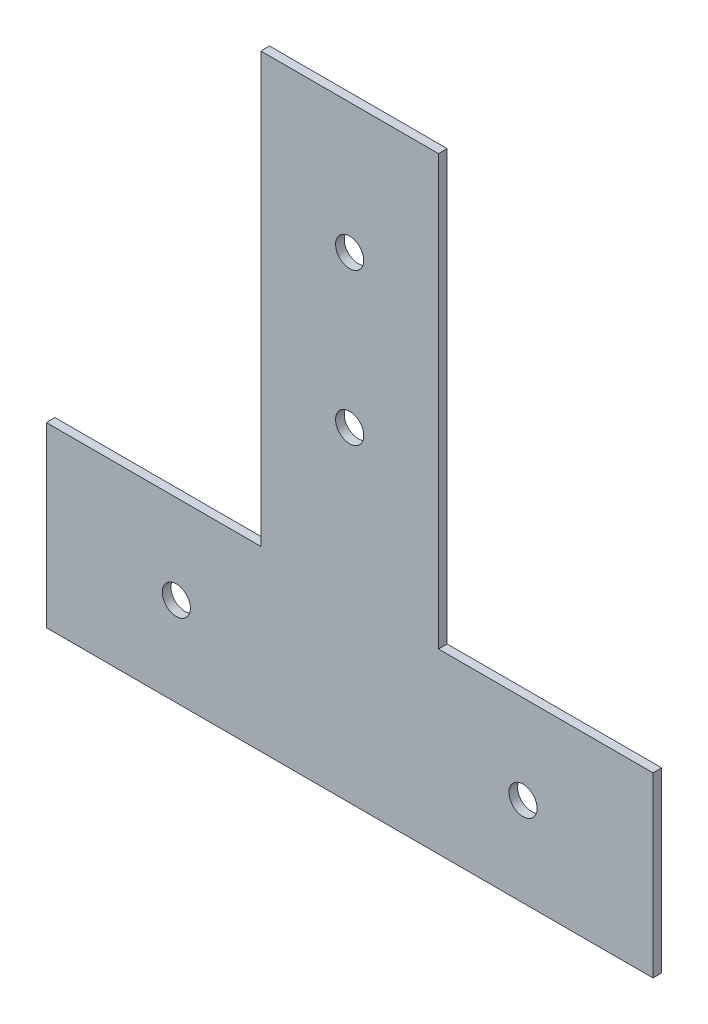
ISO-10303-21;
HEADER;
FILE_DESCRIPTION(('STEP AP214'),'2;1');
FILE_NAME('part.step','',(''),(''),'','','');
FILE_SCHEMA(('AUTOMOTIVE_DESIGN { 1 0 10303 214 1 1 1 1 }'));
ENDSEC;
DATA;
#1=APPLICATION_CONTEXT('core data for automotive mechanical design processes');
#2=APPLICATION_PROTOCOL_DEFINITION('international standard','automotive_design',2000,#1);
#3=PRODUCT_CONTEXT('',#1,'mechanical');
#4=PRODUCT('Part','Part','',(#3));
#5=PRODUCT_RELATED_PRODUCT_CATEGORY('part','',(#4));
#6=PRODUCT_DEFINITION_FORMATION('','',#4);
#7=PRODUCT_DEFINITION_CONTEXT('part definition',#1,'design');
#8=PRODUCT_DEFINITION('design','',#6,#7);
#9=PRODUCT_DEFINITION_SHAPE('','',#8);
#10=(LENGTH_UNIT() NAMED_UNIT(*) SI_UNIT(.MILLI.,.METRE.));
#11=(NAMED_UNIT(*) PLANE_ANGLE_UNIT() SI_UNIT($,.RADIAN.));
#12=(NAMED_UNIT(*) SI_UNIT($,.STERADIAN.) SOLID_ANGLE_UNIT());
#13=UNCERTAINTY_MEASURE_WITH_UNIT(LENGTH_MEASURE(1.E-05),#10,'distance_accuracy_value','');
#14=(GEOMETRIC_REPRESENTATION_CONTEXT(3) GLOBAL_UNCERTAINTY_ASSIGNED_CONTEXT((#13)) GLOBAL_UNIT_ASSIGNED_CONTEXT((#10,
#11,#12)) REPRESENTATION_CONTEXT('',''));
#15=CARTESIAN_POINT('',(0.,0.,0.));
#16=DIRECTION('',(0.,0.,1.));
#17=DIRECTION('',(1.,0.,0.));
#18=AXIS2_PLACEMENT_3D('',#15,#16,#17);
#19=CARTESIAN_POINT('',(20.5,20.5,2.));
#20=DIRECTION('',(0.,-1.,0.));
#21=DIRECTION('',(0.,0.,-1.));
#22=AXIS2_PLACEMENT_3D('',#19,#20,#21);
#23=PLANE('',#22);
#24=DIRECTION('',(-1.,0.,0.));
#25=VECTOR('',#24,1.);
#26=CARTESIAN_POINT('',(20.5,20.5,0.));
#27=LINE('',#26,#25);
#28=CARTESIAN_POINT('',(70.,20.5,0.));
#29=VERTEX_POINT('',#28);
#30=CARTESIAN_POINT('',(20.5,20.5,0.));
#31=VERTEX_POINT('',#30);
#32=EDGE_CURVE('E129',#29,#31,#27,.T.);
#33=ORIENTED_EDGE('',*,*,#32,.T.);
#34=DIRECTION('',(0.,0.,-1.));
#35=VECTOR('',#34,1.);
#36=CARTESIAN_POINT('',(20.5,20.5,2.));
#37=LINE('',#36,#35);
#38=CARTESIAN_POINT('',(20.5,20.5,2.));
#39=VERTEX_POINT('',#38);
#40=EDGE_CURVE('E11',#39,#31,#37,.T.);
#41=ORIENTED_EDGE('',*,*,#40,.F.);
#42=DIRECTION('',(-1.,0.,0.));
#43=VECTOR('',#42,1.);
#44=CARTESIAN_POINT('',(20.5,20.5,2.));
#45=LINE('',#44,#43);
#46=CARTESIAN_POINT('',(70.,20.5,2.));
#47=VERTEX_POINT('',#46);
#48=EDGE_CURVE('E144',#47,#39,#45,.T.);
#49=ORIENTED_EDGE('',*,*,#48,.F.);
#50=DIRECTION('',(0.,0.,-1.));
#51=VECTOR('',#50,1.);
#52=CARTESIAN_POINT('',(70.,20.5,2.));
#53=LINE('',#52,#51);
#54=EDGE_CURVE('E125',#47,#29,#53,.T.);
#55=ORIENTED_EDGE('',*,*,#54,.T.);
#56=EDGE_LOOP('',(#33,#41,#49,#55));
#57=FACE_BOUND('',#56,.T.);
#58=ADVANCED_FACE('F33',(#57),#23,.F.);
#59=CARTESIAN_POINT('',(20.5,20.5,2.));
#60=DIRECTION('',(-1.,0.,0.));
#61=DIRECTION('',(0.,0.,1.));
#62=AXIS2_PLACEMENT_3D('',#59,#60,#61);
#63=PLANE('',#62);
#64=DIRECTION('',(0.,1.,0.));
#65=VECTOR('',#64,1.);
#66=CARTESIAN_POINT('',(20.5,20.5,0.));
#67=LINE('',#66,#65);
#68=CARTESIAN_POINT('',(20.5,119.5,0.));
#69=VERTEX_POINT('',#68);
#70=EDGE_CURVE('E132',#31,#69,#67,.T.);
#71=ORIENTED_EDGE('',*,*,#70,.T.);
#72=DIRECTION('',(0.,0.,-1.));
#73=VECTOR('',#72,1.);
#74=CARTESIAN_POINT('',(20.5,119.5,2.));
#75=LINE('',#74,#73);
#76=CARTESIAN_POINT('',(20.5,119.5,2.));
#77=VERTEX_POINT('',#76);
#78=EDGE_CURVE('E41',#77,#69,#75,.T.);
#79=ORIENTED_EDGE('',*,*,#78,.F.);
#80=DIRECTION('',(0.,1.,0.));
#81=VECTOR('',#80,1.);
#82=CARTESIAN_POINT('',(20.5,20.5,2.));
#83=LINE('',#82,#81);
#84=EDGE_CURVE('E92',#39,#77,#83,.T.);
#85=ORIENTED_EDGE('',*,*,#84,.F.);
#86=ORIENTED_EDGE('',*,*,#40,.T.);
#87=EDGE_LOOP('',(#71,#79,#85,#86));
#88=FACE_BOUND('',#87,.T.);
#89=ADVANCED_FACE('F234',(#88),#63,.F.);
#90=CARTESIAN_POINT('',(-20.5,119.5,2.));
#91=DIRECTION('',(0.,-1.,0.));
#92=DIRECTION('',(0.,0.,-1.));
#93=AXIS2_PLACEMENT_3D('',#90,#91,#92);
#94=PLANE('',#93);
#95=DIRECTION('',(-1.,0.,0.));
#96=VECTOR('',#95,1.);
#97=CARTESIAN_POINT('',(-20.5,119.5,0.));
#98=LINE('',#97,#96);
#99=CARTESIAN_POINT('',(-20.5,119.5,0.));
#100=VERTEX_POINT('',#99);
#101=EDGE_CURVE('E135',#69,#100,#98,.T.);
#102=ORIENTED_EDGE('',*,*,#101,.T.);
#103=DIRECTION('',(0.,0.,-1.));
#104=VECTOR('',#103,1.);
#105=CARTESIAN_POINT('',(-20.5,119.5,2.));
#106=LINE('',#105,#104);
#107=CARTESIAN_POINT('',(-20.5,119.5,2.));
#108=VERTEX_POINT('',#107);
#109=EDGE_CURVE('E151',#108,#100,#106,.T.);
#110=ORIENTED_EDGE('',*,*,#109,.F.);
#111=DIRECTION('',(-1.,0.,0.));
#112=VECTOR('',#111,1.);
#113=CARTESIAN_POINT('',(-20.5,119.5,2.));
#114=LINE('',#113,#112);
#115=EDGE_CURVE('E159',#77,#108,#114,.T.);
#116=ORIENTED_EDGE('',*,*,#115,.F.);
#117=ORIENTED_EDGE('',*,*,#78,.T.);
#118=EDGE_LOOP('',(#102,#110,#116,#117));
#119=FACE_BOUND('',#118,.T.);
#120=ADVANCED_FACE('F157',(#119),#94,.F.);
#121=CARTESIAN_POINT('',(-20.5,20.5,2.));
#122=DIRECTION('',(1.,0.,0.));
#123=DIRECTION('',(0.,0.,-1.));
#124=AXIS2_PLACEMENT_3D('',#121,#122,#123);
#125=PLANE('',#124);
#126=DIRECTION('',(0.,-1.,0.));
#127=VECTOR('',#126,1.);
#128=CARTESIAN_POINT('',(-20.5,20.5,0.));
#129=LINE('',#128,#127);
#130=CARTESIAN_POINT('',(-20.5,20.5,0.));
#131=VERTEX_POINT('',#130);
#132=EDGE_CURVE('E137',#100,#131,#129,.T.);
#133=ORIENTED_EDGE('',*,*,#132,.T.);
#134=DIRECTION('',(0.,0.,-1.));
#135=VECTOR('',#134,1.);
#136=CARTESIAN_POINT('',(-20.5,20.5,2.));
#137=LINE('',#136,#135);
#138=CARTESIAN_POINT('',(-20.5,20.5,2.));
#139=VERTEX_POINT('',#138);
#140=EDGE_CURVE('E148',#139,#131,#137,.T.);
#141=ORIENTED_EDGE('',*,*,#140,.F.);
#142=DIRECTION('',(0.,-1.,0.));
#143=VECTOR('',#142,1.);
#144=CARTESIAN_POINT('',(-20.5,20.5,2.));
#145=LINE('',#144,#143);
#146=EDGE_CURVE('E171',#108,#139,#145,.T.);
#147=ORIENTED_EDGE('',*,*,#146,.F.);
#148=ORIENTED_EDGE('',*,*,#109,.T.);
#149=EDGE_LOOP('',(#133,#141,#147,#148));
#150=FACE_BOUND('',#149,.T.);
#151=ADVANCED_FACE('F167',(#150),#125,.F.);
#152=CARTESIAN_POINT('',(-70.,20.5,2.));
#153=DIRECTION('',(0.,-1.,0.));
#154=DIRECTION('',(0.,0.,-1.));
#155=AXIS2_PLACEMENT_3D('',#152,#153,#154);
#156=PLANE('',#155);
#157=DIRECTION('',(-1.,0.,0.));
#158=VECTOR('',#157,1.);
#159=CARTESIAN_POINT('',(-70.,20.5,0.));
#160=LINE('',#159,#158);
#161=CARTESIAN_POINT('',(-70.,20.5,0.));
#162=VERTEX_POINT('',#161);
#163=EDGE_CURVE('E139',#131,#162,#160,.T.);
#164=ORIENTED_EDGE('',*,*,#163,.T.);
#165=DIRECTION('',(0.,0.,-1.));
#166=VECTOR('',#165,1.);
#167=CARTESIAN_POINT('',(-70.,20.5,2.));
#168=LINE('',#167,#166);
#169=CARTESIAN_POINT('',(-70.,20.5,2.));
#170=VERTEX_POINT('',#169);
#171=EDGE_CURVE('E120',#170,#162,#168,.T.);
#172=ORIENTED_EDGE('',*,*,#171,.F.);
#173=DIRECTION('',(-1.,0.,0.));
#174=VECTOR('',#173,1.);
#175=CARTESIAN_POINT('',(-70.,20.5,2.));
#176=LINE('',#175,#174);
#177=EDGE_CURVE('E111',#139,#170,#176,.T.);
#178=ORIENTED_EDGE('',*,*,#177,.F.);
#179=ORIENTED_EDGE('',*,*,#140,.T.);
#180=EDGE_LOOP('',(#164,#172,#178,#179));
#181=FACE_BOUND('',#180,.T.);
#182=ADVANCED_FACE('F170',(#181),#156,.F.);
#183=CARTESIAN_POINT('',(-70.,-20.5,2.));
#184=DIRECTION('',(1.,0.,0.));
#185=DIRECTION('',(0.,0.,-1.));
#186=AXIS2_PLACEMENT_3D('',#183,#184,#185);
#187=PLANE('',#186);
#188=DIRECTION('',(0.,-1.,0.));
#189=VECTOR('',#188,1.);
#190=CARTESIAN_POINT('',(-70.,-20.5,0.));
#191=LINE('',#190,#189);
#192=CARTESIAN_POINT('',(-70.,-20.5,0.));
#193=VERTEX_POINT('',#192);
#194=EDGE_CURVE('E119',#162,#193,#191,.T.);
#195=ORIENTED_EDGE('',*,*,#194,.T.);
#196=DIRECTION('',(0.,0.,-1.));
#197=VECTOR('',#196,1.);
#198=CARTESIAN_POINT('',(-70.,-20.5,2.));
#199=LINE('',#198,#197);
#200=CARTESIAN_POINT('',(-70.,-20.5,2.));
#201=VERTEX_POINT('',#200);
#202=EDGE_CURVE('E116',#201,#193,#199,.T.);
#203=ORIENTED_EDGE('',*,*,#202,.F.);
#204=DIRECTION('',(0.,-1.,0.));
#205=VECTOR('',#204,1.);
#206=CARTESIAN_POINT('',(-70.,-20.5,2.));
#207=LINE('',#206,#205);
#208=EDGE_CURVE('E105',#170,#201,#207,.T.);
#209=ORIENTED_EDGE('',*,*,#208,.F.);
#210=ORIENTED_EDGE('',*,*,#171,.T.);
#211=EDGE_LOOP('',(#195,#203,#209,#210));
#212=FACE_BOUND('',#211,.T.);
#213=ADVANCED_FACE('F117',(#212),#187,.F.);
#214=CARTESIAN_POINT('',(-70.,-20.5,2.));
#215=DIRECTION('',(0.,1.,0.));
#216=DIRECTION('',(0.,0.,1.));
#217=AXIS2_PLACEMENT_3D('',#214,#215,#216);
#218=PLANE('',#217);
#219=DIRECTION('',(1.,0.,0.));
#220=VECTOR('',#219,1.);
#221=CARTESIAN_POINT('',(-70.,-20.5,0.));
#222=LINE('',#221,#220);
#223=CARTESIAN_POINT('',(70.,-20.5,0.));
#224=VERTEX_POINT('',#223);
#225=EDGE_CURVE('E78',#193,#224,#222,.T.);
#226=ORIENTED_EDGE('',*,*,#225,.T.);
#227=DIRECTION('',(0.,0.,-1.));
#228=VECTOR('',#227,1.);
#229=CARTESIAN_POINT('',(70.,-20.5,2.));
#230=LINE('',#229,#228);
#231=CARTESIAN_POINT('',(70.,-20.5,2.));
#232=VERTEX_POINT('',#231);
#233=EDGE_CURVE('E121',#232,#224,#230,.T.);
#234=ORIENTED_EDGE('',*,*,#233,.F.);
#235=DIRECTION('',(1.,0.,0.));
#236=VECTOR('',#235,1.);
#237=CARTESIAN_POINT('',(-70.,-20.5,2.));
#238=LINE('',#237,#236);
#239=EDGE_CURVE('E109',#201,#232,#238,.T.);
#240=ORIENTED_EDGE('',*,*,#239,.F.);
#241=ORIENTED_EDGE('',*,*,#202,.T.);
#242=EDGE_LOOP('',(#226,#234,#240,#241));
#243=FACE_BOUND('',#242,.T.);
#244=ADVANCED_FACE('F123',(#243),#218,.F.);
#245=CARTESIAN_POINT('',(70.,-20.5,2.));
#246=DIRECTION('',(-1.,0.,0.));
#247=DIRECTION('',(0.,0.,1.));
#248=AXIS2_PLACEMENT_3D('',#245,#246,#247);
#249=PLANE('',#248);
#250=DIRECTION('',(0.,1.,0.));
#251=VECTOR('',#250,1.);
#252=CARTESIAN_POINT('',(70.,-20.5,0.));
#253=LINE('',#252,#251);
#254=EDGE_CURVE('E84',#224,#29,#253,.T.);
#255=ORIENTED_EDGE('',*,*,#254,.T.);
#256=ORIENTED_EDGE('',*,*,#54,.F.);
#257=DIRECTION('',(0.,1.,0.));
#258=VECTOR('',#257,1.);
#259=CARTESIAN_POINT('',(70.,-20.5,2.));
#260=LINE('',#259,#258);
#261=EDGE_CURVE('E49',#232,#47,#260,.T.);
#262=ORIENTED_EDGE('',*,*,#261,.F.);
#263=ORIENTED_EDGE('',*,*,#233,.T.);
#264=EDGE_LOOP('',(#255,#256,#262,#263));
#265=FACE_BOUND('',#264,.T.);
#266=ADVANCED_FACE('F212',(#265),#249,.F.);
#267=CARTESIAN_POINT('',(70.,20.5,2.));
#268=DIRECTION('',(0.,0.,1.));
#269=DIRECTION('',(1.,0.,0.));
#270=AXIS2_PLACEMENT_3D('',#267,#268,#269);
#271=PLANE('',#270);
#272=CARTESIAN_POINT('',(40.,0.,2.));
#273=DIRECTION('',(0.,0.,1.));
#274=DIRECTION('',(-1.,0.,0.));
#275=AXIS2_PLACEMENT_3D('',#272,#273,#274);
#276=CIRCLE('',#275,3.25);
#277=CARTESIAN_POINT('',(36.75,0.,2.));
#278=VERTEX_POINT('',#277);
#279=EDGE_CURVE('E195',#278,#278,#276,.T.);
#280=ORIENTED_EDGE('',*,*,#279,.F.);
#281=EDGE_LOOP('',(#280));
#282=FACE_BOUND('',#281,.T.);
#283=CARTESIAN_POINT('',(-40.,0.,2.));
#284=DIRECTION('',(0.,0.,1.));
#285=DIRECTION('',(1.,0.,0.));
#286=AXIS2_PLACEMENT_3D('',#283,#284,#285);
#287=CIRCLE('',#286,3.25);
#288=CARTESIAN_POINT('',(-36.75,0.,2.));
#289=VERTEX_POINT('',#288);
#290=EDGE_CURVE('E189',#289,#289,#287,.T.);
#291=ORIENTED_EDGE('',*,*,#290,.F.);
#292=EDGE_LOOP('',(#291));
#293=FACE_BOUND('',#292,.T.);
#294=CARTESIAN_POINT('',(0.,54.5,2.));
#295=DIRECTION('',(0.,0.,1.));
#296=DIRECTION('',(1.,0.,0.));
#297=AXIS2_PLACEMENT_3D('',#294,#295,#296);
#298=CIRCLE('',#297,3.25);
#299=CARTESIAN_POINT('',(3.25,54.5,2.));
#300=VERTEX_POINT('',#299);
#301=EDGE_CURVE('E183',#300,#300,#298,.T.);
#302=ORIENTED_EDGE('',*,*,#301,.F.);
#303=EDGE_LOOP('',(#302));
#304=FACE_BOUND('',#303,.T.);
#305=CARTESIAN_POINT('',(0.,89.5,2.));
#306=DIRECTION('',(0.,0.,1.));
#307=DIRECTION('',(1.,0.,0.));
#308=AXIS2_PLACEMENT_3D('',#305,#306,#307);
#309=CIRCLE('',#308,3.25);
#310=CARTESIAN_POINT('',(3.25,89.5,2.));
#311=VERTEX_POINT('',#310);
#312=EDGE_CURVE('E177',#311,#311,#309,.T.);
#313=ORIENTED_EDGE('',*,*,#312,.F.);
#314=EDGE_LOOP('',(#313));
#315=FACE_BOUND('',#314,.T.);
#316=ORIENTED_EDGE('',*,*,#48,.T.);
#317=ORIENTED_EDGE('',*,*,#84,.T.);
#318=ORIENTED_EDGE('',*,*,#115,.T.);
#319=ORIENTED_EDGE('',*,*,#146,.T.);
#320=ORIENTED_EDGE('',*,*,#177,.T.);
#321=ORIENTED_EDGE('',*,*,#208,.T.);
#322=ORIENTED_EDGE('',*,*,#239,.T.);
#323=ORIENTED_EDGE('',*,*,#261,.T.);
#324=EDGE_LOOP('',(#316,#317,#318,#319,#320,#321,#322,#323));
#325=FACE_BOUND('',#324,.T.);
#326=ADVANCED_FACE('F107',(#282,#293,#304,#315,#325),#271,.T.);
#327=CARTESIAN_POINT('',(70.,20.5,0.));
#328=DIRECTION('',(0.,0.,1.));
#329=DIRECTION('',(1.,0.,0.));
#330=AXIS2_PLACEMENT_3D('',#327,#328,#329);
#331=PLANE('',#330);
#332=CARTESIAN_POINT('',(40.,0.,0.));
#333=DIRECTION('',(0.,0.,1.));
#334=DIRECTION('',(-1.,0.,0.));
#335=AXIS2_PLACEMENT_3D('',#332,#333,#334);
#336=CIRCLE('',#335,3.25);
#337=CARTESIAN_POINT('',(36.75,0.,0.));
#338=VERTEX_POINT('',#337);
#339=EDGE_CURVE('E192',#338,#338,#336,.T.);
#340=ORIENTED_EDGE('',*,*,#339,.T.);
#341=EDGE_LOOP('',(#340));
#342=FACE_BOUND('',#341,.T.);
#343=CARTESIAN_POINT('',(-40.,0.,0.));
#344=DIRECTION('',(0.,0.,1.));
#345=DIRECTION('',(1.,0.,0.));
#346=AXIS2_PLACEMENT_3D('',#343,#344,#345);
#347=CIRCLE('',#346,3.25);
#348=CARTESIAN_POINT('',(-36.75,0.,0.));
#349=VERTEX_POINT('',#348);
#350=EDGE_CURVE('E186',#349,#349,#347,.T.);
#351=ORIENTED_EDGE('',*,*,#350,.T.);
#352=EDGE_LOOP('',(#351));
#353=FACE_BOUND('',#352,.T.);
#354=CARTESIAN_POINT('',(0.,54.5,0.));
#355=DIRECTION('',(0.,0.,1.));
#356=DIRECTION('',(1.,0.,0.));
#357=AXIS2_PLACEMENT_3D('',#354,#355,#356);
#358=CIRCLE('',#357,3.25);
#359=CARTESIAN_POINT('',(3.25,54.5,0.));
#360=VERTEX_POINT('',#359);
#361=EDGE_CURVE('E180',#360,#360,#358,.T.);
#362=ORIENTED_EDGE('',*,*,#361,.T.);
#363=EDGE_LOOP('',(#362));
#364=FACE_BOUND('',#363,.T.);
#365=CARTESIAN_POINT('',(0.,89.5,0.));
#366=DIRECTION('',(0.,0.,1.));
#367=DIRECTION('',(1.,0.,0.));
#368=AXIS2_PLACEMENT_3D('',#365,#366,#367);
#369=CIRCLE('',#368,3.25);
#370=CARTESIAN_POINT('',(3.25,89.5,0.));
#371=VERTEX_POINT('',#370);
#372=EDGE_CURVE('E133',#371,#371,#369,.T.);
#373=ORIENTED_EDGE('',*,*,#372,.T.);
#374=EDGE_LOOP('',(#373));
#375=FACE_BOUND('',#374,.T.);
#376=ORIENTED_EDGE('',*,*,#32,.F.);
#377=ORIENTED_EDGE('',*,*,#254,.F.);
#378=ORIENTED_EDGE('',*,*,#225,.F.);
#379=ORIENTED_EDGE('',*,*,#194,.F.);
#380=ORIENTED_EDGE('',*,*,#163,.F.);
#381=ORIENTED_EDGE('',*,*,#132,.F.);
#382=ORIENTED_EDGE('',*,*,#101,.F.);
#383=ORIENTED_EDGE('',*,*,#70,.F.);
#384=EDGE_LOOP('',(#376,#377,#378,#379,#380,#381,#382,#383));
#385=FACE_BOUND('',#384,.T.);
#386=ADVANCED_FACE('F163',(#342,#353,#364,#375,#385),#331,.F.);
#387=CARTESIAN_POINT('',(0.,89.5,0.));
#388=DIRECTION('',(0.,0.,1.));
#389=DIRECTION('',(1.,0.,0.));
#390=AXIS2_PLACEMENT_3D('',#387,#388,#389);
#391=CYLINDRICAL_SURFACE('',#390,3.25);
#392=ORIENTED_EDGE('',*,*,#372,.F.);
#393=EDGE_LOOP('',(#392));
#394=FACE_BOUND('',#393,.T.);
#395=ORIENTED_EDGE('',*,*,#312,.T.);
#396=EDGE_LOOP('',(#395));
#397=FACE_BOUND('',#396,.T.);
#398=ADVANCED_FACE('F220',(#394,#397),#391,.F.);
#399=CARTESIAN_POINT('',(0.,54.5,0.));
#400=DIRECTION('',(0.,0.,1.));
#401=DIRECTION('',(1.,0.,0.));
#402=AXIS2_PLACEMENT_3D('',#399,#400,#401);
#403=CYLINDRICAL_SURFACE('',#402,3.25);
#404=ORIENTED_EDGE('',*,*,#361,.F.);
#405=EDGE_LOOP('',(#404));
#406=FACE_BOUND('',#405,.T.);
#407=ORIENTED_EDGE('',*,*,#301,.T.);
#408=EDGE_LOOP('',(#407));
#409=FACE_BOUND('',#408,.T.);
#410=ADVANCED_FACE('F222',(#406,#409),#403,.F.);
#411=CARTESIAN_POINT('',(-40.,0.,0.));
#412=DIRECTION('',(0.,0.,1.));
#413=DIRECTION('',(1.,0.,0.));
#414=AXIS2_PLACEMENT_3D('',#411,#412,#413);
#415=CYLINDRICAL_SURFACE('',#414,3.25);
#416=ORIENTED_EDGE('',*,*,#350,.F.);
#417=EDGE_LOOP('',(#416));
#418=FACE_BOUND('',#417,.T.);
#419=ORIENTED_EDGE('',*,*,#290,.T.);
#420=EDGE_LOOP('',(#419));
#421=FACE_BOUND('',#420,.T.);
#422=ADVANCED_FACE('F206',(#418,#421),#415,.F.);
#423=CARTESIAN_POINT('',(40.,0.,0.));
#424=DIRECTION('',(0.,0.,1.));
#425=DIRECTION('',(1.,0.,0.));
#426=AXIS2_PLACEMENT_3D('',#423,#424,#425);
#427=CYLINDRICAL_SURFACE('',#426,3.25);
#428=ORIENTED_EDGE('',*,*,#339,.F.);
#429=EDGE_LOOP('',(#428));
#430=FACE_BOUND('',#429,.T.);
#431=ORIENTED_EDGE('',*,*,#279,.T.);
#432=EDGE_LOOP('',(#431));
#433=FACE_BOUND('',#432,.T.);
#434=ADVANCED_FACE('F203',(#430,#433),#427,.F.);
#435=CLOSED_SHELL('',(#58,#89,#120,#151,#182,#213,#244,#266,#326,#386,#398,#410,#422,#434));
#436=MANIFOLD_SOLID_BREP('B2',#435);
#437=ADVANCED_BREP_SHAPE_REPRESENTATION('',(#18,#436),#14);
#438=SHAPE_DEFINITION_REPRESENTATION(#9,#437);
ENDSEC;
END-ISO-10303-21;
